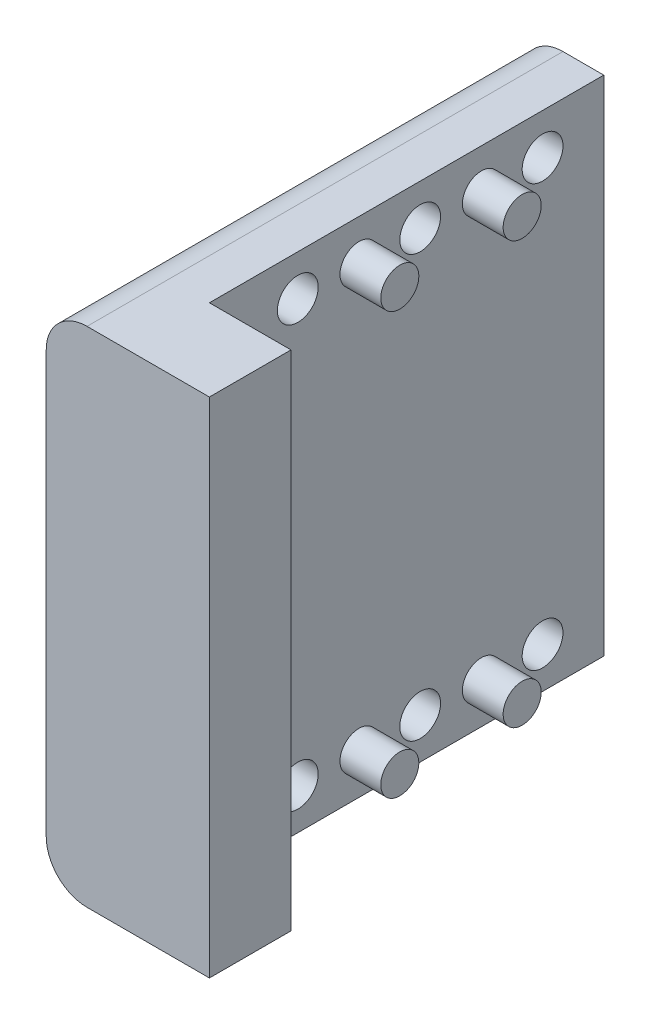
ISO-10303-21;
HEADER;
FILE_DESCRIPTION(('STEP AP214'),'2;1');
FILE_NAME('part.step','',(''),(''),'','','');
FILE_SCHEMA(('AUTOMOTIVE_DESIGN { 1 0 10303 214 1 1 1 1 }'));
ENDSEC;
DATA;
#1=APPLICATION_CONTEXT('core data for automotive mechanical design processes');
#2=APPLICATION_PROTOCOL_DEFINITION('international standard','automotive_design',2000,#1);
#3=PRODUCT_CONTEXT('',#1,'mechanical');
#4=PRODUCT('Part','Part','',(#3));
#5=PRODUCT_RELATED_PRODUCT_CATEGORY('part','',(#4));
#6=PRODUCT_DEFINITION_FORMATION('','',#4);
#7=PRODUCT_DEFINITION_CONTEXT('part definition',#1,'design');
#8=PRODUCT_DEFINITION('design','',#6,#7);
#9=PRODUCT_DEFINITION_SHAPE('','',#8);
#10=(LENGTH_UNIT() NAMED_UNIT(*) SI_UNIT(.MILLI.,.METRE.));
#11=(NAMED_UNIT(*) PLANE_ANGLE_UNIT() SI_UNIT($,.RADIAN.));
#12=(NAMED_UNIT(*) SI_UNIT($,.STERADIAN.) SOLID_ANGLE_UNIT());
#13=UNCERTAINTY_MEASURE_WITH_UNIT(LENGTH_MEASURE(1.E-05),#10,'distance_accuracy_value','');
#14=(GEOMETRIC_REPRESENTATION_CONTEXT(3) GLOBAL_UNCERTAINTY_ASSIGNED_CONTEXT((#13)) GLOBAL_UNIT_ASSIGNED_CONTEXT((#10,
#11,#12)) REPRESENTATION_CONTEXT('',''));
#15=CARTESIAN_POINT('',(0.,0.,0.));
#16=DIRECTION('',(0.,0.,1.));
#17=DIRECTION('',(1.,0.,0.));
#18=AXIS2_PLACEMENT_3D('',#15,#16,#17);
#19=CARTESIAN_POINT('',(-9.83022457121385,37.,-22.3907517216672));
#20=DIRECTION('',(0.,0.,1.));
#21=DIRECTION('',(1.,0.,0.));
#22=AXIS2_PLACEMENT_3D('',#19,#20,#21);
#23=PLANE('',#22);
#24=CARTESIAN_POINT('',(-12.8302245712139,34.,-22.3907517216672));
#25=DIRECTION('',(0.,0.,-1.));
#26=DIRECTION('',(1.,0.,0.));
#27=AXIS2_PLACEMENT_3D('',#24,#25,#26);
#28=CIRCLE('',#27,3.);
#29=CARTESIAN_POINT('',(-15.8302245712139,34.,-22.3907517216672));
#30=VERTEX_POINT('',#29);
#31=CARTESIAN_POINT('',(-12.8302245712138,37.,-22.3907517216672));
#32=VERTEX_POINT('',#31);
#33=EDGE_CURVE('E108',#30,#32,#28,.T.);
#34=ORIENTED_EDGE('',*,*,#33,.T.);
#35=DIRECTION('',(-1.,0.,0.));
#36=VECTOR('',#35,1.);
#37=CARTESIAN_POINT('',(-9.83022457121385,37.,-22.3907517216672));
#38=LINE('',#37,#36);
#39=CARTESIAN_POINT('',(-9.83022457121385,37.,-22.3907517216672));
#40=VERTEX_POINT('',#39);
#41=EDGE_CURVE('E188',#40,#32,#38,.T.);
#42=ORIENTED_EDGE('',*,*,#41,.F.);
#43=DIRECTION('',(0.,-1.,0.));
#44=VECTOR('',#43,1.);
#45=CARTESIAN_POINT('',(-9.83022457121385,37.,-22.3907517216672));
#46=LINE('',#45,#44);
#47=CARTESIAN_POINT('',(-9.83022457121385,0.,-22.3907517216672));
#48=VERTEX_POINT('',#47);
#49=EDGE_CURVE('E182',#40,#48,#46,.T.);
#50=ORIENTED_EDGE('',*,*,#49,.T.);
#51=DIRECTION('',(-1.,0.,0.));
#52=VECTOR('',#51,1.);
#53=CARTESIAN_POINT('',(-9.83022457121385,0.,-22.3907517216672));
#54=LINE('',#53,#52);
#55=CARTESIAN_POINT('',(-12.8302245712138,0.,-22.3907517216672));
#56=VERTEX_POINT('',#55);
#57=EDGE_CURVE('E117',#48,#56,#54,.T.);
#58=ORIENTED_EDGE('',*,*,#57,.T.);
#59=CARTESIAN_POINT('',(-12.8302245712139,3.,-22.3907517216672));
#60=DIRECTION('',(0.,0.,-1.));
#61=DIRECTION('',(1.,0.,0.));
#62=AXIS2_PLACEMENT_3D('',#59,#60,#61);
#63=CIRCLE('',#62,3.);
#64=CARTESIAN_POINT('',(-15.8302245712139,3.00000000000002,-22.3907517216672));
#65=VERTEX_POINT('',#64);
#66=EDGE_CURVE('E59',#56,#65,#63,.T.);
#67=ORIENTED_EDGE('',*,*,#66,.T.);
#68=DIRECTION('',(0.,-1.,0.));
#69=VECTOR('',#68,1.);
#70=CARTESIAN_POINT('',(-15.8302245712139,37.,-22.3907517216672));
#71=LINE('',#70,#69);
#72=EDGE_CURVE('E114',#30,#65,#71,.T.);
#73=ORIENTED_EDGE('',*,*,#72,.F.);
#74=EDGE_LOOP('',(#34,#42,#50,#58,#67,#73));
#75=FACE_BOUND('',#74,.T.);
#76=ADVANCED_FACE('F37',(#75),#23,.F.);
#77=CARTESIAN_POINT('',(-15.8302245712139,37.,-22.3907517216672));
#78=DIRECTION('',(1.,0.,0.));
#79=DIRECTION('',(0.,0.,-1.));
#80=AXIS2_PLACEMENT_3D('',#77,#78,#79);
#81=PLANE('',#80);
#82=DIRECTION('',(0.,-1.,0.));
#83=VECTOR('',#82,1.);
#84=CARTESIAN_POINT('',(-15.8302245712139,37.,12.6092482783328));
#85=LINE('',#84,#83);
#86=CARTESIAN_POINT('',(-15.8302245712138,34.,12.6092482783328));
#87=VERTEX_POINT('',#86);
#88=CARTESIAN_POINT('',(-15.8302245712138,3.00000000000002,12.6092482783328));
#89=VERTEX_POINT('',#88);
#90=EDGE_CURVE('E123',#87,#89,#85,.T.);
#91=ORIENTED_EDGE('',*,*,#90,.F.);
#92=DIRECTION('',(0.,0.,-1.));
#93=VECTOR('',#92,1.);
#94=CARTESIAN_POINT('',(-15.8302245712138,34.,14.6092482783328));
#95=LINE('',#94,#93);
#96=EDGE_CURVE('E107',#87,#30,#95,.T.);
#97=ORIENTED_EDGE('',*,*,#96,.T.);
#98=ORIENTED_EDGE('',*,*,#72,.T.);
#99=DIRECTION('',(0.,0.,-1.));
#100=VECTOR('',#99,1.);
#101=CARTESIAN_POINT('',(-15.8302245712138,3.00000000000002,14.6092482783328));
#102=LINE('',#101,#100);
#103=EDGE_CURVE('E99',#89,#65,#102,.T.);
#104=ORIENTED_EDGE('',*,*,#103,.F.);
#105=EDGE_LOOP('',(#91,#97,#98,#104));
#106=FACE_BOUND('',#105,.T.);
#107=ADVANCED_FACE('F121',(#106),#81,.F.);
#108=CARTESIAN_POINT('',(-15.8302245712139,37.,12.6092482783328));
#109=DIRECTION('',(0.,0.,-1.));
#110=DIRECTION('',(-1.,0.,0.));
#111=AXIS2_PLACEMENT_3D('',#108,#109,#110);
#112=PLANE('',#111);
#113=CARTESIAN_POINT('',(-12.8302245712138,34.,12.6092482783328));
#114=DIRECTION('',(0.,0.,-1.));
#115=DIRECTION('',(-1.,0.,0.));
#116=AXIS2_PLACEMENT_3D('',#113,#114,#115);
#117=CIRCLE('',#116,3.);
#118=CARTESIAN_POINT('',(-12.8302245712138,37.,12.6092482783328));
#119=VERTEX_POINT('',#118);
#120=EDGE_CURVE('E51',#87,#119,#117,.T.);
#121=ORIENTED_EDGE('',*,*,#120,.F.);
#122=ORIENTED_EDGE('',*,*,#90,.T.);
#123=CARTESIAN_POINT('',(-12.8302245712138,3.,12.6092482783328));
#124=DIRECTION('',(0.,0.,-1.));
#125=DIRECTION('',(-1.,0.,0.));
#126=AXIS2_PLACEMENT_3D('',#123,#124,#125);
#127=CIRCLE('',#126,3.);
#128=CARTESIAN_POINT('',(-12.8302245712138,0.,12.6092482783328));
#129=VERTEX_POINT('',#128);
#130=EDGE_CURVE('E102',#129,#89,#127,.T.);
#131=ORIENTED_EDGE('',*,*,#130,.F.);
#132=DIRECTION('',(1.,0.,0.));
#133=VECTOR('',#132,1.);
#134=CARTESIAN_POINT('',(-15.8302245712139,0.,12.6092482783328));
#135=LINE('',#134,#133);
#136=CARTESIAN_POINT('',(-3.83022457121385,0.,12.6092482783328));
#137=VERTEX_POINT('',#136);
#138=EDGE_CURVE('E196',#129,#137,#135,.T.);
#139=ORIENTED_EDGE('',*,*,#138,.T.);
#140=DIRECTION('',(0.,-1.,0.));
#141=VECTOR('',#140,1.);
#142=CARTESIAN_POINT('',(-3.83022457121385,37.,12.6092482783328));
#143=LINE('',#142,#141);
#144=CARTESIAN_POINT('',(-3.83022457121385,37.,12.6092482783328));
#145=VERTEX_POINT('',#144);
#146=EDGE_CURVE('E127',#145,#137,#143,.T.);
#147=ORIENTED_EDGE('',*,*,#146,.F.);
#148=DIRECTION('',(1.,0.,0.));
#149=VECTOR('',#148,1.);
#150=CARTESIAN_POINT('',(-15.8302245712139,37.,12.6092482783328));
#151=LINE('',#150,#149);
#152=EDGE_CURVE('E223',#119,#145,#151,.T.);
#153=ORIENTED_EDGE('',*,*,#152,.F.);
#154=EDGE_LOOP('',(#121,#122,#131,#139,#147,#153));
#155=FACE_BOUND('',#154,.T.);
#156=ADVANCED_FACE('F298',(#155),#112,.F.);
#157=CARTESIAN_POINT('',(-3.83022457121385,37.,12.6092482783328));
#158=DIRECTION('',(-1.,0.,0.));
#159=DIRECTION('',(0.,0.,1.));
#160=AXIS2_PLACEMENT_3D('',#157,#158,#159);
#161=PLANE('',#160);
#162=DIRECTION('',(0.,0.,-1.));
#163=VECTOR('',#162,1.);
#164=CARTESIAN_POINT('',(-3.83022457121385,0.,12.6092482783328));
#165=LINE('',#164,#163);
#166=CARTESIAN_POINT('',(-3.83022457121385,0.,6.6092482783328));
#167=VERTEX_POINT('',#166);
#168=EDGE_CURVE('E198',#137,#167,#165,.T.);
#169=ORIENTED_EDGE('',*,*,#168,.T.);
#170=DIRECTION('',(0.,-1.,0.));
#171=VECTOR('',#170,1.);
#172=CARTESIAN_POINT('',(-3.83022457121385,37.,6.6092482783328));
#173=LINE('',#172,#171);
#174=CARTESIAN_POINT('',(-3.83022457121385,37.,6.6092482783328));
#175=VERTEX_POINT('',#174);
#176=EDGE_CURVE('E207',#175,#167,#173,.T.);
#177=ORIENTED_EDGE('',*,*,#176,.F.);
#178=DIRECTION('',(0.,0.,-1.));
#179=VECTOR('',#178,1.);
#180=CARTESIAN_POINT('',(-3.83022457121385,37.,12.6092482783328));
#181=LINE('',#180,#179);
#182=EDGE_CURVE('E216',#145,#175,#181,.T.);
#183=ORIENTED_EDGE('',*,*,#182,.F.);
#184=ORIENTED_EDGE('',*,*,#146,.T.);
#185=EDGE_LOOP('',(#169,#177,#183,#184));
#186=FACE_BOUND('',#185,.T.);
#187=ADVANCED_FACE('F214',(#186),#161,.F.);
#188=CARTESIAN_POINT('',(-3.83022457121385,37.,6.6092482783328));
#189=DIRECTION('',(0.,0.,1.));
#190=DIRECTION('',(1.,0.,0.));
#191=AXIS2_PLACEMENT_3D('',#188,#189,#190);
#192=PLANE('',#191);
#193=CARTESIAN_POINT('',(-6.83022457121385,34.,6.6092482783328));
#194=DIRECTION('',(0.,0.,-1.));
#195=DIRECTION('',(-1.,0.,0.));
#196=AXIS2_PLACEMENT_3D('',#193,#194,#195);
#197=CIRCLE('',#196,1.5);
#198=CARTESIAN_POINT('',(-8.33022457121385,34.,6.6092482783328));
#199=VERTEX_POINT('',#198);
#200=EDGE_CURVE('E262',#199,#199,#197,.T.);
#201=ORIENTED_EDGE('',*,*,#200,.F.);
#202=EDGE_LOOP('',(#201));
#203=FACE_BOUND('',#202,.T.);
#204=CARTESIAN_POINT('',(-6.83022457121386,3.,6.6092482783328));
#205=DIRECTION('',(0.,0.,-1.));
#206=DIRECTION('',(-1.,0.,0.));
#207=AXIS2_PLACEMENT_3D('',#204,#205,#206);
#208=CIRCLE('',#207,1.5);
#209=CARTESIAN_POINT('',(-8.33022457121386,3.,6.6092482783328));
#210=VERTEX_POINT('',#209);
#211=EDGE_CURVE('E258',#210,#210,#208,.T.);
#212=ORIENTED_EDGE('',*,*,#211,.F.);
#213=EDGE_LOOP('',(#212));
#214=FACE_BOUND('',#213,.T.);
#215=DIRECTION('',(-1.,0.,0.));
#216=VECTOR('',#215,1.);
#217=CARTESIAN_POINT('',(-3.83022457121385,0.,6.6092482783328));
#218=LINE('',#217,#216);
#219=CARTESIAN_POINT('',(-9.83022457121385,0.,6.60924827833281));
#220=VERTEX_POINT('',#219);
#221=EDGE_CURVE('E189',#167,#220,#218,.T.);
#222=ORIENTED_EDGE('',*,*,#221,.T.);
#223=DIRECTION('',(0.,-1.,0.));
#224=VECTOR('',#223,1.);
#225=CARTESIAN_POINT('',(-9.83022457121385,37.,6.60924827833281));
#226=LINE('',#225,#224);
#227=CARTESIAN_POINT('',(-9.83022457121385,37.,6.60924827833281));
#228=VERTEX_POINT('',#227);
#229=EDGE_CURVE('E185',#228,#220,#226,.T.);
#230=ORIENTED_EDGE('',*,*,#229,.F.);
#231=DIRECTION('',(-1.,0.,0.));
#232=VECTOR('',#231,1.);
#233=CARTESIAN_POINT('',(-3.83022457121385,37.,6.6092482783328));
#234=LINE('',#233,#232);
#235=EDGE_CURVE('E221',#175,#228,#234,.T.);
#236=ORIENTED_EDGE('',*,*,#235,.F.);
#237=ORIENTED_EDGE('',*,*,#176,.T.);
#238=EDGE_LOOP('',(#222,#230,#236,#237));
#239=FACE_BOUND('',#238,.T.);
#240=ADVANCED_FACE('F146',(#203,#214,#239),#192,.F.);
#241=CARTESIAN_POINT('',(-9.83022457121385,37.,6.60924827833281));
#242=DIRECTION('',(-1.,0.,0.));
#243=DIRECTION('',(0.,0.,1.));
#244=AXIS2_PLACEMENT_3D('',#241,#242,#243);
#245=PLANE('',#244);
#246=CARTESIAN_POINT('',(-9.83022457121385,34.,-13.3907517216672));
#247=DIRECTION('',(-1.,0.,0.));
#248=DIRECTION('',(0.,0.,1.));
#249=AXIS2_PLACEMENT_3D('',#246,#247,#248);
#250=CIRCLE('',#249,1.4);
#251=CARTESIAN_POINT('',(-9.83022457121385,34.,-11.9907517216672));
#252=VERTEX_POINT('',#251);
#253=EDGE_CURVE('E12',#252,#252,#250,.F.);
#254=ORIENTED_EDGE('',*,*,#253,.F.);
#255=EDGE_LOOP('',(#254));
#256=FACE_BOUND('',#255,.T.);
#257=CARTESIAN_POINT('',(-9.83022457121385,3.,-13.3907517216672));
#258=DIRECTION('',(-1.,0.,0.));
#259=DIRECTION('',(0.,0.,1.));
#260=AXIS2_PLACEMENT_3D('',#257,#258,#259);
#261=CIRCLE('',#260,1.4);
#262=CARTESIAN_POINT('',(-9.83022457121385,3.,-11.9907517216672));
#263=VERTEX_POINT('',#262);
#264=EDGE_CURVE('E44',#263,#263,#261,.F.);
#265=ORIENTED_EDGE('',*,*,#264,.F.);
#266=EDGE_LOOP('',(#265));
#267=FACE_BOUND('',#266,.T.);
#268=CARTESIAN_POINT('',(-9.83022457121385,34.,-4.3907517216672));
#269=DIRECTION('',(-1.,0.,0.));
#270=DIRECTION('',(0.,0.,1.));
#271=AXIS2_PLACEMENT_3D('',#268,#269,#270);
#272=CIRCLE('',#271,1.4);
#273=CARTESIAN_POINT('',(-9.83022457121385,34.,-2.9907517216672));
#274=VERTEX_POINT('',#273);
#275=EDGE_CURVE('E135',#274,#274,#272,.F.);
#276=ORIENTED_EDGE('',*,*,#275,.F.);
#277=EDGE_LOOP('',(#276));
#278=FACE_BOUND('',#277,.T.);
#279=CARTESIAN_POINT('',(-9.83022457121385,3.,-4.3907517216672));
#280=DIRECTION('',(-1.,0.,0.));
#281=DIRECTION('',(0.,0.,1.));
#282=AXIS2_PLACEMENT_3D('',#279,#280,#281);
#283=CIRCLE('',#282,1.4);
#284=CARTESIAN_POINT('',(-9.83022457121385,3.,-2.99075172166719));
#285=VERTEX_POINT('',#284);
#286=EDGE_CURVE('E132',#285,#285,#283,.F.);
#287=ORIENTED_EDGE('',*,*,#286,.F.);
#288=EDGE_LOOP('',(#287));
#289=FACE_BOUND('',#288,.T.);
#290=CARTESIAN_POINT('',(-9.83022457121385,3.,-17.8907517216672));
#291=DIRECTION('',(1.,0.,0.));
#292=DIRECTION('',(0.,0.,-1.));
#293=AXIS2_PLACEMENT_3D('',#290,#291,#292);
#294=CIRCLE('',#293,1.5);
#295=CARTESIAN_POINT('',(-9.83022457121385,3.,-19.3907517216672));
#296=VERTEX_POINT('',#295);
#297=EDGE_CURVE('E156',#296,#296,#294,.T.);
#298=ORIENTED_EDGE('',*,*,#297,.F.);
#299=EDGE_LOOP('',(#298));
#300=FACE_BOUND('',#299,.T.);
#301=CARTESIAN_POINT('',(-9.83022457121385,3.,-8.8907517216672));
#302=DIRECTION('',(1.,0.,0.));
#303=DIRECTION('',(0.,0.,-1.));
#304=AXIS2_PLACEMENT_3D('',#301,#302,#303);
#305=CIRCLE('',#304,1.5);
#306=CARTESIAN_POINT('',(-9.83022457121385,3.,-10.3907517216672));
#307=VERTEX_POINT('',#306);
#308=EDGE_CURVE('E160',#307,#307,#305,.T.);
#309=ORIENTED_EDGE('',*,*,#308,.F.);
#310=EDGE_LOOP('',(#309));
#311=FACE_BOUND('',#310,.T.);
#312=CARTESIAN_POINT('',(-9.83022457121385,3.,0.109248278332806));
#313=DIRECTION('',(1.,0.,0.));
#314=DIRECTION('',(0.,0.,-1.));
#315=AXIS2_PLACEMENT_3D('',#312,#313,#314);
#316=CIRCLE('',#315,1.5);
#317=CARTESIAN_POINT('',(-9.83022457121385,3.,-1.39075172166719));
#318=VERTEX_POINT('',#317);
#319=EDGE_CURVE('E164',#318,#318,#316,.T.);
#320=ORIENTED_EDGE('',*,*,#319,.F.);
#321=EDGE_LOOP('',(#320));
#322=FACE_BOUND('',#321,.T.);
#323=CARTESIAN_POINT('',(-9.83022457121385,34.,-8.8907517216672));
#324=DIRECTION('',(1.,0.,0.));
#325=DIRECTION('',(0.,0.,-1.));
#326=AXIS2_PLACEMENT_3D('',#323,#324,#325);
#327=CIRCLE('',#326,1.5);
#328=CARTESIAN_POINT('',(-9.83022457121385,34.,-10.3907517216672));
#329=VERTEX_POINT('',#328);
#330=EDGE_CURVE('E168',#329,#329,#327,.T.);
#331=ORIENTED_EDGE('',*,*,#330,.F.);
#332=EDGE_LOOP('',(#331));
#333=FACE_BOUND('',#332,.T.);
#334=CARTESIAN_POINT('',(-9.83022457121385,34.,-17.8907517216672));
#335=DIRECTION('',(1.,0.,0.));
#336=DIRECTION('',(0.,0.,-1.));
#337=AXIS2_PLACEMENT_3D('',#334,#335,#336);
#338=CIRCLE('',#337,1.5);
#339=CARTESIAN_POINT('',(-9.83022457121385,34.,-19.3907517216672));
#340=VERTEX_POINT('',#339);
#341=EDGE_CURVE('E172',#340,#340,#338,.T.);
#342=ORIENTED_EDGE('',*,*,#341,.F.);
#343=EDGE_LOOP('',(#342));
#344=FACE_BOUND('',#343,.T.);
#345=CARTESIAN_POINT('',(-9.83022457121385,34.,0.109248278332803));
#346=DIRECTION('',(1.,0.,0.));
#347=DIRECTION('',(0.,0.,-1.));
#348=AXIS2_PLACEMENT_3D('',#345,#346,#347);
#349=CIRCLE('',#348,1.5);
#350=CARTESIAN_POINT('',(-9.83022457121385,34.,-1.3907517216672));
#351=VERTEX_POINT('',#350);
#352=EDGE_CURVE('E176',#351,#351,#349,.T.);
#353=ORIENTED_EDGE('',*,*,#352,.F.);
#354=EDGE_LOOP('',(#353));
#355=FACE_BOUND('',#354,.T.);
#356=DIRECTION('',(0.,0.,-1.));
#357=VECTOR('',#356,1.);
#358=CARTESIAN_POINT('',(-9.83022457121385,0.,6.60924827833281));
#359=LINE('',#358,#357);
#360=EDGE_CURVE('E180',#220,#48,#359,.T.);
#361=ORIENTED_EDGE('',*,*,#360,.T.);
#362=ORIENTED_EDGE('',*,*,#49,.F.);
#363=DIRECTION('',(0.,0.,-1.));
#364=VECTOR('',#363,1.);
#365=CARTESIAN_POINT('',(-9.83022457121385,37.,6.60924827833281));
#366=LINE('',#365,#364);
#367=EDGE_CURVE('E192',#228,#40,#366,.T.);
#368=ORIENTED_EDGE('',*,*,#367,.F.);
#369=ORIENTED_EDGE('',*,*,#229,.T.);
#370=EDGE_LOOP('',(#361,#362,#368,#369));
#371=FACE_BOUND('',#370,.T.);
#372=ADVANCED_FACE('F142',(#256,#267,#278,#289,#300,#311,#322,#333,#344,#355,#371),#245,.F.);
#373=CARTESIAN_POINT('',(0.,37.,0.));
#374=DIRECTION('',(0.,1.,0.));
#375=DIRECTION('',(0.,0.,1.));
#376=AXIS2_PLACEMENT_3D('',#373,#374,#375);
#377=PLANE('',#376);
#378=DIRECTION('',(0.,0.,-1.));
#379=VECTOR('',#378,1.);
#380=CARTESIAN_POINT('',(-12.8302245712138,37.,14.6092482783328));
#381=LINE('',#380,#379);
#382=EDGE_CURVE('E125',#119,#32,#381,.T.);
#383=ORIENTED_EDGE('',*,*,#382,.F.);
#384=ORIENTED_EDGE('',*,*,#152,.T.);
#385=ORIENTED_EDGE('',*,*,#182,.T.);
#386=ORIENTED_EDGE('',*,*,#235,.T.);
#387=ORIENTED_EDGE('',*,*,#367,.T.);
#388=ORIENTED_EDGE('',*,*,#41,.T.);
#389=EDGE_LOOP('',(#383,#384,#385,#386,#387,#388));
#390=FACE_BOUND('',#389,.T.);
#391=ADVANCED_FACE('F145',(#390),#377,.T.);
#392=CARTESIAN_POINT('',(0.,0.,0.));
#393=DIRECTION('',(0.,1.,0.));
#394=DIRECTION('',(0.,0.,1.));
#395=AXIS2_PLACEMENT_3D('',#392,#393,#394);
#396=PLANE('',#395);
#397=ORIENTED_EDGE('',*,*,#138,.F.);
#398=DIRECTION('',(0.,0.,-1.));
#399=VECTOR('',#398,1.);
#400=CARTESIAN_POINT('',(-12.8302245712138,0.,14.6092482783328));
#401=LINE('',#400,#399);
#402=EDGE_CURVE('E122',#129,#56,#401,.T.);
#403=ORIENTED_EDGE('',*,*,#402,.T.);
#404=ORIENTED_EDGE('',*,*,#57,.F.);
#405=ORIENTED_EDGE('',*,*,#360,.F.);
#406=ORIENTED_EDGE('',*,*,#221,.F.);
#407=ORIENTED_EDGE('',*,*,#168,.F.);
#408=EDGE_LOOP('',(#397,#403,#404,#405,#406,#407));
#409=FACE_BOUND('',#408,.T.);
#410=ADVANCED_FACE('F195',(#409),#396,.F.);
#411=CARTESIAN_POINT('',(-12.8302245712138,3.,14.6092482783328));
#412=DIRECTION('',(0.,0.,-1.));
#413=DIRECTION('',(-1.,0.,0.));
#414=AXIS2_PLACEMENT_3D('',#411,#412,#413);
#415=CYLINDRICAL_SURFACE('',#414,3.);
#416=ORIENTED_EDGE('',*,*,#130,.T.);
#417=ORIENTED_EDGE('',*,*,#103,.T.);
#418=ORIENTED_EDGE('',*,*,#66,.F.);
#419=ORIENTED_EDGE('',*,*,#402,.F.);
#420=EDGE_LOOP('',(#416,#417,#418,#419));
#421=FACE_BOUND('',#420,.T.);
#422=ADVANCED_FACE('F100',(#421),#415,.T.);
#423=CARTESIAN_POINT('',(-12.8302245712138,34.,14.6092482783328));
#424=DIRECTION('',(0.,0.,-1.));
#425=DIRECTION('',(-1.,0.,0.));
#426=AXIS2_PLACEMENT_3D('',#423,#424,#425);
#427=CYLINDRICAL_SURFACE('',#426,3.);
#428=ORIENTED_EDGE('',*,*,#120,.T.);
#429=ORIENTED_EDGE('',*,*,#382,.T.);
#430=ORIENTED_EDGE('',*,*,#33,.F.);
#431=ORIENTED_EDGE('',*,*,#96,.F.);
#432=EDGE_LOOP('',(#428,#429,#430,#431));
#433=FACE_BOUND('',#432,.T.);
#434=ADVANCED_FACE('F315',(#433),#427,.T.);
#435=CARTESIAN_POINT('',(-13.3302245712139,34.,0.109248278332803));
#436=DIRECTION('',(1.,0.,0.));
#437=DIRECTION('',(0.,0.,-1.));
#438=AXIS2_PLACEMENT_3D('',#435,#436,#437);
#439=CYLINDRICAL_SURFACE('',#438,1.5);
#440=CARTESIAN_POINT('',(-13.3302245712139,34.,0.109248278332803));
#441=DIRECTION('',(1.,0.,0.));
#442=DIRECTION('',(0.,0.,-1.));
#443=AXIS2_PLACEMENT_3D('',#440,#441,#442);
#444=CIRCLE('',#443,1.5);
#445=CARTESIAN_POINT('',(-13.3302245712139,34.,-1.3907517216672));
#446=VERTEX_POINT('',#445);
#447=EDGE_CURVE('E118',#446,#446,#444,.T.);
#448=ORIENTED_EDGE('',*,*,#447,.F.);
#449=EDGE_LOOP('',(#448));
#450=FACE_BOUND('',#449,.T.);
#451=ORIENTED_EDGE('',*,*,#352,.T.);
#452=EDGE_LOOP('',(#451));
#453=FACE_BOUND('',#452,.T.);
#454=ADVANCED_FACE('F318',(#450,#453),#439,.F.);
#455=CARTESIAN_POINT('',(-13.3302245712139,34.,0.109248278332803));
#456=DIRECTION('',(1.,0.,0.));
#457=DIRECTION('',(0.,0.,-1.));
#458=AXIS2_PLACEMENT_3D('',#455,#456,#457);
#459=PLANE('',#458);
#460=ORIENTED_EDGE('',*,*,#447,.T.);
#461=EDGE_LOOP('',(#460));
#462=FACE_BOUND('',#461,.T.);
#463=ADVANCED_FACE('F321',(#462),#459,.T.);
#464=CARTESIAN_POINT('',(-13.3302245712139,34.,-17.8907517216672));
#465=DIRECTION('',(1.,0.,0.));
#466=DIRECTION('',(0.,0.,-1.));
#467=AXIS2_PLACEMENT_3D('',#464,#465,#466);
#468=CYLINDRICAL_SURFACE('',#467,1.5);
#469=CARTESIAN_POINT('',(-13.3302245712139,34.,-17.8907517216672));
#470=DIRECTION('',(1.,0.,0.));
#471=DIRECTION('',(0.,0.,-1.));
#472=AXIS2_PLACEMENT_3D('',#469,#470,#471);
#473=CIRCLE('',#472,1.5);
#474=CARTESIAN_POINT('',(-13.3302245712139,34.,-19.3907517216672));
#475=VERTEX_POINT('',#474);
#476=EDGE_CURVE('E250',#475,#475,#473,.T.);
#477=ORIENTED_EDGE('',*,*,#476,.F.);
#478=EDGE_LOOP('',(#477));
#479=FACE_BOUND('',#478,.T.);
#480=ORIENTED_EDGE('',*,*,#341,.T.);
#481=EDGE_LOOP('',(#480));
#482=FACE_BOUND('',#481,.T.);
#483=ADVANCED_FACE('F325',(#479,#482),#468,.F.);
#484=CARTESIAN_POINT('',(-13.3302245712139,34.,-17.8907517216672));
#485=DIRECTION('',(1.,0.,0.));
#486=DIRECTION('',(0.,0.,-1.));
#487=AXIS2_PLACEMENT_3D('',#484,#485,#486);
#488=PLANE('',#487);
#489=ORIENTED_EDGE('',*,*,#476,.T.);
#490=EDGE_LOOP('',(#489));
#491=FACE_BOUND('',#490,.T.);
#492=ADVANCED_FACE('F343',(#491),#488,.T.);
#493=CARTESIAN_POINT('',(-13.3302245712139,34.,-8.8907517216672));
#494=DIRECTION('',(1.,0.,0.));
#495=DIRECTION('',(0.,0.,-1.));
#496=AXIS2_PLACEMENT_3D('',#493,#494,#495);
#497=CYLINDRICAL_SURFACE('',#496,1.5);
#498=CARTESIAN_POINT('',(-13.3302245712139,34.,-8.8907517216672));
#499=DIRECTION('',(1.,0.,0.));
#500=DIRECTION('',(0.,0.,-1.));
#501=AXIS2_PLACEMENT_3D('',#498,#499,#500);
#502=CIRCLE('',#501,1.5);
#503=CARTESIAN_POINT('',(-13.3302245712139,34.,-10.3907517216672));
#504=VERTEX_POINT('',#503);
#505=EDGE_CURVE('E238',#504,#504,#502,.T.);
#506=ORIENTED_EDGE('',*,*,#505,.F.);
#507=EDGE_LOOP('',(#506));
#508=FACE_BOUND('',#507,.T.);
#509=ORIENTED_EDGE('',*,*,#330,.T.);
#510=EDGE_LOOP('',(#509));
#511=FACE_BOUND('',#510,.T.);
#512=ADVANCED_FACE('F339',(#508,#511),#497,.F.);
#513=CARTESIAN_POINT('',(-13.3302245712139,34.,-8.8907517216672));
#514=DIRECTION('',(1.,0.,0.));
#515=DIRECTION('',(0.,0.,-1.));
#516=AXIS2_PLACEMENT_3D('',#513,#514,#515);
#517=PLANE('',#516);
#518=ORIENTED_EDGE('',*,*,#505,.T.);
#519=EDGE_LOOP('',(#518));
#520=FACE_BOUND('',#519,.T.);
#521=ADVANCED_FACE('F335',(#520),#517,.T.);
#522=CARTESIAN_POINT('',(-13.3302245712139,3.,0.109248278332806));
#523=DIRECTION('',(1.,0.,0.));
#524=DIRECTION('',(0.,0.,-1.));
#525=AXIS2_PLACEMENT_3D('',#522,#523,#524);
#526=CYLINDRICAL_SURFACE('',#525,1.5);
#527=CARTESIAN_POINT('',(-13.3302245712139,3.,0.109248278332806));
#528=DIRECTION('',(1.,0.,0.));
#529=DIRECTION('',(0.,0.,-1.));
#530=AXIS2_PLACEMENT_3D('',#527,#528,#529);
#531=CIRCLE('',#530,1.5);
#532=CARTESIAN_POINT('',(-13.3302245712139,3.,-1.39075172166719));
#533=VERTEX_POINT('',#532);
#534=EDGE_CURVE('E234',#533,#533,#531,.T.);
#535=ORIENTED_EDGE('',*,*,#534,.F.);
#536=EDGE_LOOP('',(#535));
#537=FACE_BOUND('',#536,.T.);
#538=ORIENTED_EDGE('',*,*,#319,.T.);
#539=EDGE_LOOP('',(#538));
#540=FACE_BOUND('',#539,.T.);
#541=ADVANCED_FACE('F331',(#537,#540),#526,.F.);
#542=CARTESIAN_POINT('',(-13.3302245712139,3.,0.109248278332806));
#543=DIRECTION('',(1.,0.,0.));
#544=DIRECTION('',(0.,0.,-1.));
#545=AXIS2_PLACEMENT_3D('',#542,#543,#544);
#546=PLANE('',#545);
#547=ORIENTED_EDGE('',*,*,#534,.T.);
#548=EDGE_LOOP('',(#547));
#549=FACE_BOUND('',#548,.T.);
#550=ADVANCED_FACE('F327',(#549),#546,.T.);
#551=CARTESIAN_POINT('',(-13.3302245712139,3.,-8.8907517216672));
#552=DIRECTION('',(1.,0.,0.));
#553=DIRECTION('',(0.,0.,-1.));
#554=AXIS2_PLACEMENT_3D('',#551,#552,#553);
#555=CYLINDRICAL_SURFACE('',#554,1.5);
#556=CARTESIAN_POINT('',(-13.3302245712139,3.,-8.8907517216672));
#557=DIRECTION('',(1.,0.,0.));
#558=DIRECTION('',(0.,0.,-1.));
#559=AXIS2_PLACEMENT_3D('',#556,#557,#558);
#560=CIRCLE('',#559,1.5);
#561=CARTESIAN_POINT('',(-13.3302245712139,3.,-10.3907517216672));
#562=VERTEX_POINT('',#561);
#563=EDGE_CURVE('E246',#562,#562,#560,.T.);
#564=ORIENTED_EDGE('',*,*,#563,.F.);
#565=EDGE_LOOP('',(#564));
#566=FACE_BOUND('',#565,.T.);
#567=ORIENTED_EDGE('',*,*,#308,.T.);
#568=EDGE_LOOP('',(#567));
#569=FACE_BOUND('',#568,.T.);
#570=ADVANCED_FACE('F330',(#566,#569),#555,.F.);
#571=CARTESIAN_POINT('',(-13.3302245712139,3.,-8.8907517216672));
#572=DIRECTION('',(1.,0.,0.));
#573=DIRECTION('',(0.,0.,-1.));
#574=AXIS2_PLACEMENT_3D('',#571,#572,#573);
#575=PLANE('',#574);
#576=ORIENTED_EDGE('',*,*,#563,.T.);
#577=EDGE_LOOP('',(#576));
#578=FACE_BOUND('',#577,.T.);
#579=ADVANCED_FACE('F353',(#578),#575,.T.);
#580=CARTESIAN_POINT('',(-13.3302245712139,3.,-17.8907517216672));
#581=DIRECTION('',(1.,0.,0.));
#582=DIRECTION('',(0.,0.,-1.));
#583=AXIS2_PLACEMENT_3D('',#580,#581,#582);
#584=CYLINDRICAL_SURFACE('',#583,1.5);
#585=CARTESIAN_POINT('',(-13.3302245712139,3.,-17.8907517216672));
#586=DIRECTION('',(1.,0.,0.));
#587=DIRECTION('',(0.,0.,-1.));
#588=AXIS2_PLACEMENT_3D('',#585,#586,#587);
#589=CIRCLE('',#588,1.5);
#590=CARTESIAN_POINT('',(-13.3302245712139,3.,-19.3907517216672));
#591=VERTEX_POINT('',#590);
#592=EDGE_CURVE('E242',#591,#591,#589,.T.);
#593=ORIENTED_EDGE('',*,*,#592,.F.);
#594=EDGE_LOOP('',(#593));
#595=FACE_BOUND('',#594,.T.);
#596=ORIENTED_EDGE('',*,*,#297,.T.);
#597=EDGE_LOOP('',(#596));
#598=FACE_BOUND('',#597,.T.);
#599=ADVANCED_FACE('F349',(#595,#598),#584,.F.);
#600=CARTESIAN_POINT('',(-13.3302245712139,3.,-17.8907517216672));
#601=DIRECTION('',(1.,0.,0.));
#602=DIRECTION('',(0.,0.,-1.));
#603=AXIS2_PLACEMENT_3D('',#600,#601,#602);
#604=PLANE('',#603);
#605=ORIENTED_EDGE('',*,*,#592,.T.);
#606=EDGE_LOOP('',(#605));
#607=FACE_BOUND('',#606,.T.);
#608=ADVANCED_FACE('F345',(#607),#604,.T.);
#609=CARTESIAN_POINT('',(-6.83022457121386,3.,10.1092482783328));
#610=DIRECTION('',(0.,0.,-1.));
#611=DIRECTION('',(-1.,0.,0.));
#612=AXIS2_PLACEMENT_3D('',#609,#610,#611);
#613=CYLINDRICAL_SURFACE('',#612,1.5);
#614=CARTESIAN_POINT('',(-6.83022457121386,3.,10.1092482783328));
#615=DIRECTION('',(0.,0.,-1.));
#616=DIRECTION('',(-1.,0.,0.));
#617=AXIS2_PLACEMENT_3D('',#614,#615,#616);
#618=CIRCLE('',#617,1.5);
#619=CARTESIAN_POINT('',(-8.33022457121385,3.,10.1092482783328));
#620=VERTEX_POINT('',#619);
#621=EDGE_CURVE('E255',#620,#620,#618,.T.);
#622=ORIENTED_EDGE('',*,*,#621,.F.);
#623=EDGE_LOOP('',(#622));
#624=FACE_BOUND('',#623,.T.);
#625=ORIENTED_EDGE('',*,*,#211,.T.);
#626=EDGE_LOOP('',(#625));
#627=FACE_BOUND('',#626,.T.);
#628=ADVANCED_FACE('F348',(#624,#627),#613,.F.);
#629=CARTESIAN_POINT('',(-6.83022457121386,3.,10.1092482783328));
#630=DIRECTION('',(0.,0.,-1.));
#631=DIRECTION('',(-1.,0.,0.));
#632=AXIS2_PLACEMENT_3D('',#629,#630,#631);
#633=PLANE('',#632);
#634=ORIENTED_EDGE('',*,*,#621,.T.);
#635=EDGE_LOOP('',(#634));
#636=FACE_BOUND('',#635,.T.);
#637=ADVANCED_FACE('F367',(#636),#633,.T.);
#638=CARTESIAN_POINT('',(-6.83022457121385,34.,10.1092482783328));
#639=DIRECTION('',(0.,0.,-1.));
#640=DIRECTION('',(-1.,0.,0.));
#641=AXIS2_PLACEMENT_3D('',#638,#639,#640);
#642=CYLINDRICAL_SURFACE('',#641,1.5);
#643=CARTESIAN_POINT('',(-6.83022457121385,34.,10.1092482783328));
#644=DIRECTION('',(0.,0.,-1.));
#645=DIRECTION('',(-1.,0.,0.));
#646=AXIS2_PLACEMENT_3D('',#643,#644,#645);
#647=CIRCLE('',#646,1.5);
#648=CARTESIAN_POINT('',(-8.33022457121385,34.,10.1092482783328));
#649=VERTEX_POINT('',#648);
#650=EDGE_CURVE('E253',#649,#649,#647,.T.);
#651=ORIENTED_EDGE('',*,*,#650,.F.);
#652=EDGE_LOOP('',(#651));
#653=FACE_BOUND('',#652,.T.);
#654=ORIENTED_EDGE('',*,*,#200,.T.);
#655=EDGE_LOOP('',(#654));
#656=FACE_BOUND('',#655,.T.);
#657=ADVANCED_FACE('F370',(#653,#656),#642,.F.);
#658=CARTESIAN_POINT('',(-6.83022457121385,34.,10.1092482783328));
#659=DIRECTION('',(0.,0.,-1.));
#660=DIRECTION('',(-1.,0.,0.));
#661=AXIS2_PLACEMENT_3D('',#658,#659,#660);
#662=PLANE('',#661);
#663=ORIENTED_EDGE('',*,*,#650,.T.);
#664=EDGE_LOOP('',(#663));
#665=FACE_BOUND('',#664,.T.);
#666=ADVANCED_FACE('F377',(#665),#662,.T.);
#667=CARTESIAN_POINT('',(-6.83022457121385,3.,-4.3907517216672));
#668=DIRECTION('',(-1.,0.,0.));
#669=DIRECTION('',(0.,0.,1.));
#670=AXIS2_PLACEMENT_3D('',#667,#668,#669);
#671=CYLINDRICAL_SURFACE('',#670,1.4);
#672=CARTESIAN_POINT('',(-6.83022457121385,3.,-4.3907517216672));
#673=DIRECTION('',(1.,0.,0.));
#674=DIRECTION('',(0.,0.,-1.));
#675=AXIS2_PLACEMENT_3D('',#672,#673,#674);
#676=CIRCLE('',#675,1.4);
#677=CARTESIAN_POINT('',(-6.83022457121385,3.,-5.79075172166719));
#678=VERTEX_POINT('',#677);
#679=EDGE_CURVE('E259',#678,#678,#676,.T.);
#680=ORIENTED_EDGE('',*,*,#679,.F.);
#681=EDGE_LOOP('',(#680));
#682=FACE_BOUND('',#681,.T.);
#683=ORIENTED_EDGE('',*,*,#286,.T.);
#684=EDGE_LOOP('',(#683));
#685=FACE_BOUND('',#684,.T.);
#686=ADVANCED_FACE('F381',(#682,#685),#671,.T.);
#687=CARTESIAN_POINT('',(-6.83022457121385,3.,-4.3907517216672));
#688=DIRECTION('',(1.,0.,0.));
#689=DIRECTION('',(0.,0.,-1.));
#690=AXIS2_PLACEMENT_3D('',#687,#688,#689);
#691=PLANE('',#690);
#692=ORIENTED_EDGE('',*,*,#679,.T.);
#693=EDGE_LOOP('',(#692));
#694=FACE_BOUND('',#693,.T.);
#695=ADVANCED_FACE('F385',(#694),#691,.T.);
#696=CARTESIAN_POINT('',(-6.83022457121385,34.,-4.3907517216672));
#697=DIRECTION('',(-1.,0.,0.));
#698=DIRECTION('',(0.,0.,1.));
#699=AXIS2_PLACEMENT_3D('',#696,#697,#698);
#700=CYLINDRICAL_SURFACE('',#699,1.4);
#701=CARTESIAN_POINT('',(-6.83022457121385,34.,-4.3907517216672));
#702=DIRECTION('',(1.,0.,0.));
#703=DIRECTION('',(0.,0.,-1.));
#704=AXIS2_PLACEMENT_3D('',#701,#702,#703);
#705=CIRCLE('',#704,1.4);
#706=CARTESIAN_POINT('',(-6.83022457121385,34.,-5.7907517216672));
#707=VERTEX_POINT('',#706);
#708=EDGE_CURVE('E269',#707,#707,#705,.T.);
#709=ORIENTED_EDGE('',*,*,#708,.F.);
#710=EDGE_LOOP('',(#709));
#711=FACE_BOUND('',#710,.T.);
#712=ORIENTED_EDGE('',*,*,#275,.T.);
#713=EDGE_LOOP('',(#712));
#714=FACE_BOUND('',#713,.T.);
#715=ADVANCED_FACE('F389',(#711,#714),#700,.T.);
#716=CARTESIAN_POINT('',(-6.83022457121385,34.,-4.3907517216672));
#717=DIRECTION('',(1.,0.,0.));
#718=DIRECTION('',(0.,0.,-1.));
#719=AXIS2_PLACEMENT_3D('',#716,#717,#718);
#720=PLANE('',#719);
#721=ORIENTED_EDGE('',*,*,#708,.T.);
#722=EDGE_LOOP('',(#721));
#723=FACE_BOUND('',#722,.T.);
#724=ADVANCED_FACE('F391',(#723),#720,.T.);
#725=CARTESIAN_POINT('',(-6.83022457121385,3.,-13.3907517216672));
#726=DIRECTION('',(-1.,0.,0.));
#727=DIRECTION('',(0.,0.,1.));
#728=AXIS2_PLACEMENT_3D('',#725,#726,#727);
#729=CYLINDRICAL_SURFACE('',#728,1.4);
#730=CARTESIAN_POINT('',(-6.83022457121385,3.,-13.3907517216672));
#731=DIRECTION('',(1.,0.,0.));
#732=DIRECTION('',(0.,0.,-1.));
#733=AXIS2_PLACEMENT_3D('',#730,#731,#732);
#734=CIRCLE('',#733,1.4);
#735=CARTESIAN_POINT('',(-6.83022457121385,3.,-14.7907517216672));
#736=VERTEX_POINT('',#735);
#737=EDGE_CURVE('E272',#736,#736,#734,.T.);
#738=ORIENTED_EDGE('',*,*,#737,.F.);
#739=EDGE_LOOP('',(#738));
#740=FACE_BOUND('',#739,.T.);
#741=ORIENTED_EDGE('',*,*,#264,.T.);
#742=EDGE_LOOP('',(#741));
#743=FACE_BOUND('',#742,.T.);
#744=ADVANCED_FACE('F140',(#740,#743),#729,.T.);
#745=CARTESIAN_POINT('',(-6.83022457121385,3.,-13.3907517216672));
#746=DIRECTION('',(1.,0.,0.));
#747=DIRECTION('',(0.,0.,-1.));
#748=AXIS2_PLACEMENT_3D('',#745,#746,#747);
#749=PLANE('',#748);
#750=ORIENTED_EDGE('',*,*,#737,.T.);
#751=EDGE_LOOP('',(#750));
#752=FACE_BOUND('',#751,.T.);
#753=ADVANCED_FACE('F284',(#752),#749,.T.);
#754=CARTESIAN_POINT('',(-6.83022457121385,34.,-13.3907517216672));
#755=DIRECTION('',(-1.,0.,0.));
#756=DIRECTION('',(0.,0.,1.));
#757=AXIS2_PLACEMENT_3D('',#754,#755,#756);
#758=CYLINDRICAL_SURFACE('',#757,1.4);
#759=CARTESIAN_POINT('',(-6.83022457121385,34.,-13.3907517216672));
#760=DIRECTION('',(1.,0.,0.));
#761=DIRECTION('',(0.,0.,-1.));
#762=AXIS2_PLACEMENT_3D('',#759,#760,#761);
#763=CIRCLE('',#762,1.4);
#764=CARTESIAN_POINT('',(-6.83022457121385,34.,-14.7907517216672));
#765=VERTEX_POINT('',#764);
#766=EDGE_CURVE('E275',#765,#765,#763,.T.);
#767=ORIENTED_EDGE('',*,*,#766,.F.);
#768=EDGE_LOOP('',(#767));
#769=FACE_BOUND('',#768,.T.);
#770=ORIENTED_EDGE('',*,*,#253,.T.);
#771=EDGE_LOOP('',(#770));
#772=FACE_BOUND('',#771,.T.);
#773=ADVANCED_FACE('F281',(#769,#772),#758,.T.);
#774=CARTESIAN_POINT('',(-6.83022457121385,34.,-13.3907517216672));
#775=DIRECTION('',(1.,0.,0.));
#776=DIRECTION('',(0.,0.,-1.));
#777=AXIS2_PLACEMENT_3D('',#774,#775,#776);
#778=PLANE('',#777);
#779=ORIENTED_EDGE('',*,*,#766,.T.);
#780=EDGE_LOOP('',(#779));
#781=FACE_BOUND('',#780,.T.);
#782=ADVANCED_FACE('F279',(#781),#778,.T.);
#783=CLOSED_SHELL('',(#76,#107,#156,#187,#240,#372,#391,#410,#422,#434,#454,#463,#483,#492,#512,
#521,#541,#550,#570,#579,#599,#608,#628,#637,#657,#666,#686,#695,#715,#724,#744,#753,#773,#782));
#784=MANIFOLD_SOLID_BREP('B2',#783);
#785=ADVANCED_BREP_SHAPE_REPRESENTATION('',(#18,#784),#14);
#786=SHAPE_DEFINITION_REPRESENTATION(#9,#785);
ENDSEC;
END-ISO-10303-21;
